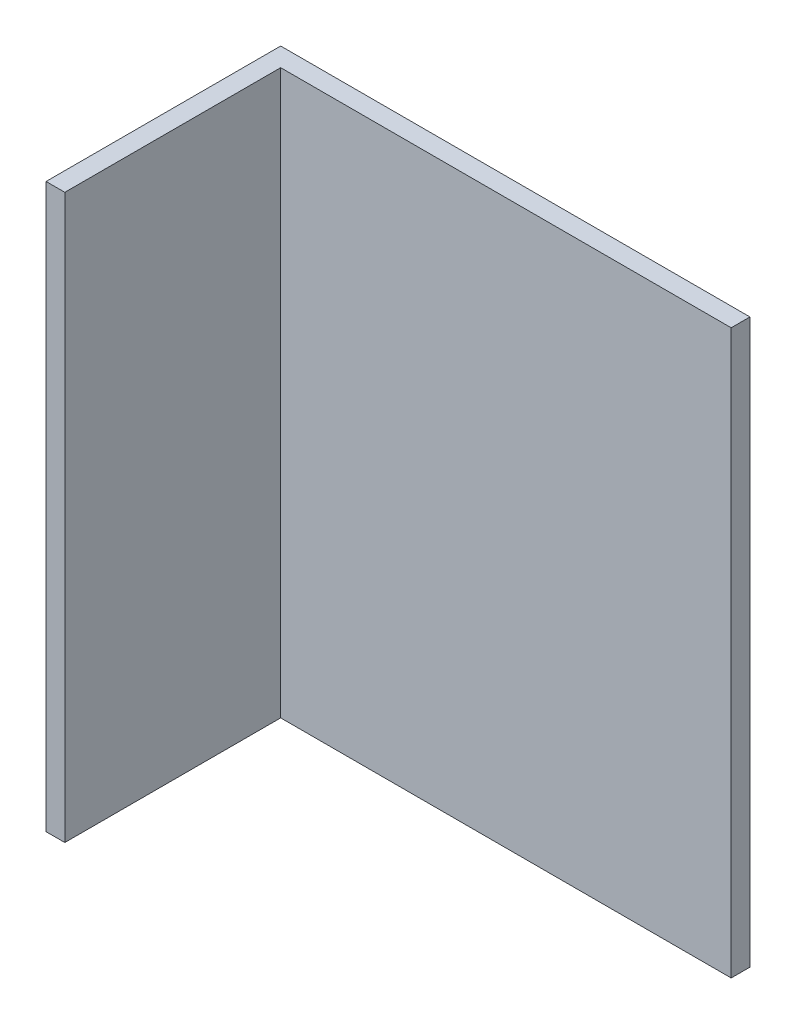
ISO-10303-21;
HEADER;
FILE_DESCRIPTION(('STEP AP214'),'2;1');
FILE_NAME('part.step','',(''),(''),'','','');
FILE_SCHEMA(('AUTOMOTIVE_DESIGN { 1 0 10303 214 1 1 1 1 }'));
ENDSEC;
DATA;
#1=APPLICATION_CONTEXT('core data for automotive mechanical design processes');
#2=APPLICATION_PROTOCOL_DEFINITION('international standard','automotive_design',2000,#1);
#3=PRODUCT_CONTEXT('',#1,'mechanical');
#4=PRODUCT('Part','Part','',(#3));
#5=PRODUCT_RELATED_PRODUCT_CATEGORY('part','',(#4));
#6=PRODUCT_DEFINITION_FORMATION('','',#4);
#7=PRODUCT_DEFINITION_CONTEXT('part definition',#1,'design');
#8=PRODUCT_DEFINITION('design','',#6,#7);
#9=PRODUCT_DEFINITION_SHAPE('','',#8);
#10=(LENGTH_UNIT() NAMED_UNIT(*) SI_UNIT(.MILLI.,.METRE.));
#11=(NAMED_UNIT(*) PLANE_ANGLE_UNIT() SI_UNIT($,.RADIAN.));
#12=(NAMED_UNIT(*) SI_UNIT($,.STERADIAN.) SOLID_ANGLE_UNIT());
#13=UNCERTAINTY_MEASURE_WITH_UNIT(LENGTH_MEASURE(1.E-05),#10,'distance_accuracy_value','');
#14=(GEOMETRIC_REPRESENTATION_CONTEXT(3) GLOBAL_UNCERTAINTY_ASSIGNED_CONTEXT((#13)) GLOBAL_UNIT_ASSIGNED_CONTEXT((#10,
#11,#12)) REPRESENTATION_CONTEXT('',''));
#15=CARTESIAN_POINT('',(0.,0.,0.));
#16=DIRECTION('',(0.,0.,1.));
#17=DIRECTION('',(1.,0.,0.));
#18=AXIS2_PLACEMENT_3D('',#15,#16,#17);
#19=CARTESIAN_POINT('',(0.,240.,8.));
#20=DIRECTION('',(0.,0.,-1.));
#21=DIRECTION('',(-1.,0.,0.));
#22=AXIS2_PLACEMENT_3D('',#19,#20,#21);
#23=PLANE('',#22);
#24=DIRECTION('',(0.,1.,0.));
#25=VECTOR('',#24,1.);
#26=CARTESIAN_POINT('',(8.,240.,8.));
#27=LINE('',#26,#25);
#28=CARTESIAN_POINT('',(8.00000000000001,0.,8.));
#29=VERTEX_POINT('',#28);
#30=CARTESIAN_POINT('',(8.,240.,8.));
#31=VERTEX_POINT('',#30);
#32=EDGE_CURVE('E49',#29,#31,#27,.T.);
#33=ORIENTED_EDGE('',*,*,#32,.F.);
#34=DIRECTION('',(1.,0.,0.));
#35=VECTOR('',#34,1.);
#36=CARTESIAN_POINT('',(0.,0.,8.));
#37=LINE('',#36,#35);
#38=CARTESIAN_POINT('',(200.,0.,8.));
#39=VERTEX_POINT('',#38);
#40=EDGE_CURVE('E86',#29,#39,#37,.T.);
#41=ORIENTED_EDGE('',*,*,#40,.T.);
#42=DIRECTION('',(0.,1.,0.));
#43=VECTOR('',#42,1.);
#44=CARTESIAN_POINT('',(200.,0.,8.));
#45=LINE('',#44,#43);
#46=CARTESIAN_POINT('',(200.,240.,8.));
#47=VERTEX_POINT('',#46);
#48=EDGE_CURVE('E55',#39,#47,#45,.T.);
#49=ORIENTED_EDGE('',*,*,#48,.T.);
#50=DIRECTION('',(-1.,0.,0.));
#51=VECTOR('',#50,1.);
#52=CARTESIAN_POINT('',(0.,240.,8.));
#53=LINE('',#52,#51);
#54=EDGE_CURVE('E96',#47,#31,#53,.T.);
#55=ORIENTED_EDGE('',*,*,#54,.T.);
#56=EDGE_LOOP('',(#33,#41,#49,#55));
#57=FACE_BOUND('',#56,.T.);
#58=ADVANCED_FACE('F32',(#57),#23,.F.);
#59=CARTESIAN_POINT('',(0.,0.,8.));
#60=DIRECTION('',(1.,0.,0.));
#61=DIRECTION('',(0.,0.,-1.));
#62=AXIS2_PLACEMENT_3D('',#59,#60,#61);
#63=PLANE('',#62);
#64=DIRECTION('',(0.,-1.,0.));
#65=VECTOR('',#64,1.);
#66=CARTESIAN_POINT('',(0.,0.,0.));
#67=LINE('',#66,#65);
#68=CARTESIAN_POINT('',(0.,240.,0.));
#69=VERTEX_POINT('',#68);
#70=CARTESIAN_POINT('',(0.,0.,0.));
#71=VERTEX_POINT('',#70);
#72=EDGE_CURVE('E93',#69,#71,#67,.T.);
#73=ORIENTED_EDGE('',*,*,#72,.T.);
#74=DIRECTION('',(0.,0.,-1.));
#75=VECTOR('',#74,1.);
#76=CARTESIAN_POINT('',(0.,0.,8.));
#77=LINE('',#76,#75);
#78=CARTESIAN_POINT('',(0.,0.,100.));
#79=VERTEX_POINT('',#78);
#80=EDGE_CURVE('E11',#79,#71,#77,.T.);
#81=ORIENTED_EDGE('',*,*,#80,.F.);
#82=DIRECTION('',(0.,-1.,0.));
#83=VECTOR('',#82,1.);
#84=CARTESIAN_POINT('',(0.,240.,100.));
#85=LINE('',#84,#83);
#86=CARTESIAN_POINT('',(0.,240.,100.));
#87=VERTEX_POINT('',#86);
#88=EDGE_CURVE('E95',#87,#79,#85,.T.);
#89=ORIENTED_EDGE('',*,*,#88,.F.);
#90=DIRECTION('',(0.,0.,-1.));
#91=VECTOR('',#90,1.);
#92=CARTESIAN_POINT('',(0.,240.,8.));
#93=LINE('',#92,#91);
#94=EDGE_CURVE('E79',#87,#69,#93,.T.);
#95=ORIENTED_EDGE('',*,*,#94,.T.);
#96=EDGE_LOOP('',(#73,#81,#89,#95));
#97=FACE_BOUND('',#96,.T.);
#98=ADVANCED_FACE('F34',(#97),#63,.F.);
#99=CARTESIAN_POINT('',(0.,0.,8.));
#100=DIRECTION('',(0.,1.,0.));
#101=DIRECTION('',(0.,0.,1.));
#102=AXIS2_PLACEMENT_3D('',#99,#100,#101);
#103=PLANE('',#102);
#104=DIRECTION('',(1.,0.,0.));
#105=VECTOR('',#104,1.);
#106=CARTESIAN_POINT('',(0.,0.,0.));
#107=LINE('',#106,#105);
#108=CARTESIAN_POINT('',(200.,0.,0.));
#109=VERTEX_POINT('',#108);
#110=EDGE_CURVE('E99',#71,#109,#107,.T.);
#111=ORIENTED_EDGE('',*,*,#110,.T.);
#112=DIRECTION('',(0.,0.,-1.));
#113=VECTOR('',#112,1.);
#114=CARTESIAN_POINT('',(200.,0.,8.));
#115=LINE('',#114,#113);
#116=EDGE_CURVE('E41',#39,#109,#115,.T.);
#117=ORIENTED_EDGE('',*,*,#116,.F.);
#118=ORIENTED_EDGE('',*,*,#40,.F.);
#119=DIRECTION('',(0.,0.,-1.));
#120=VECTOR('',#119,1.);
#121=CARTESIAN_POINT('',(8.00000000000003,0.,100.));
#122=LINE('',#121,#120);
#123=CARTESIAN_POINT('',(8.00000000000003,0.,100.));
#124=VERTEX_POINT('',#123);
#125=EDGE_CURVE('E100',#124,#29,#122,.T.);
#126=ORIENTED_EDGE('',*,*,#125,.F.);
#127=DIRECTION('',(1.,0.,0.));
#128=VECTOR('',#127,1.);
#129=CARTESIAN_POINT('',(0.,0.,100.));
#130=LINE('',#129,#128);
#131=EDGE_CURVE('E136',#79,#124,#130,.T.);
#132=ORIENTED_EDGE('',*,*,#131,.F.);
#133=ORIENTED_EDGE('',*,*,#80,.T.);
#134=EDGE_LOOP('',(#111,#117,#118,#126,#132,#133));
#135=FACE_BOUND('',#134,.T.);
#136=ADVANCED_FACE('F149',(#135),#103,.F.);
#137=CARTESIAN_POINT('',(200.,0.,8.));
#138=DIRECTION('',(-1.,0.,0.));
#139=DIRECTION('',(0.,0.,1.));
#140=AXIS2_PLACEMENT_3D('',#137,#138,#139);
#141=PLANE('',#140);
#142=DIRECTION('',(0.,1.,0.));
#143=VECTOR('',#142,1.);
#144=CARTESIAN_POINT('',(200.,0.,0.));
#145=LINE('',#144,#143);
#146=CARTESIAN_POINT('',(200.,240.,0.));
#147=VERTEX_POINT('',#146);
#148=EDGE_CURVE('E87',#109,#147,#145,.T.);
#149=ORIENTED_EDGE('',*,*,#148,.T.);
#150=DIRECTION('',(0.,0.,-1.));
#151=VECTOR('',#150,1.);
#152=CARTESIAN_POINT('',(200.,240.,8.));
#153=LINE('',#152,#151);
#154=EDGE_CURVE('E82',#47,#147,#153,.T.);
#155=ORIENTED_EDGE('',*,*,#154,.F.);
#156=ORIENTED_EDGE('',*,*,#48,.F.);
#157=ORIENTED_EDGE('',*,*,#116,.T.);
#158=EDGE_LOOP('',(#149,#155,#156,#157));
#159=FACE_BOUND('',#158,.T.);
#160=ADVANCED_FACE('F152',(#159),#141,.F.);
#161=CARTESIAN_POINT('',(0.,240.,8.));
#162=DIRECTION('',(0.,-1.,0.));
#163=DIRECTION('',(0.,0.,-1.));
#164=AXIS2_PLACEMENT_3D('',#161,#162,#163);
#165=PLANE('',#164);
#166=DIRECTION('',(-1.,0.,0.));
#167=VECTOR('',#166,1.);
#168=CARTESIAN_POINT('',(0.,240.,0.));
#169=LINE('',#168,#167);
#170=EDGE_CURVE('E75',#147,#69,#169,.T.);
#171=ORIENTED_EDGE('',*,*,#170,.T.);
#172=ORIENTED_EDGE('',*,*,#94,.F.);
#173=DIRECTION('',(-1.,0.,0.));
#174=VECTOR('',#173,1.);
#175=CARTESIAN_POINT('',(0.,240.,100.));
#176=LINE('',#175,#174);
#177=CARTESIAN_POINT('',(8.,240.,100.));
#178=VERTEX_POINT('',#177);
#179=EDGE_CURVE('E129',#178,#87,#176,.T.);
#180=ORIENTED_EDGE('',*,*,#179,.F.);
#181=DIRECTION('',(0.,0.,-1.));
#182=VECTOR('',#181,1.);
#183=CARTESIAN_POINT('',(8.,240.,100.));
#184=LINE('',#183,#182);
#185=EDGE_CURVE('E104',#178,#31,#184,.T.);
#186=ORIENTED_EDGE('',*,*,#185,.T.);
#187=ORIENTED_EDGE('',*,*,#54,.F.);
#188=ORIENTED_EDGE('',*,*,#154,.T.);
#189=EDGE_LOOP('',(#171,#172,#180,#186,#187,#188));
#190=FACE_BOUND('',#189,.T.);
#191=ADVANCED_FACE('F77',(#190),#165,.F.);
#192=CARTESIAN_POINT('',(0.,240.,0.));
#193=DIRECTION('',(0.,0.,-1.));
#194=DIRECTION('',(-1.,0.,0.));
#195=AXIS2_PLACEMENT_3D('',#192,#193,#194);
#196=PLANE('',#195);
#197=ORIENTED_EDGE('',*,*,#72,.F.);
#198=ORIENTED_EDGE('',*,*,#170,.F.);
#199=ORIENTED_EDGE('',*,*,#148,.F.);
#200=ORIENTED_EDGE('',*,*,#110,.F.);
#201=EDGE_LOOP('',(#197,#198,#199,#200));
#202=FACE_BOUND('',#201,.T.);
#203=ADVANCED_FACE('F98',(#202),#196,.T.);
#204=CARTESIAN_POINT('',(8.,240.,100.));
#205=DIRECTION('',(-1.,0.,0.));
#206=DIRECTION('',(0.,-1.,0.));
#207=AXIS2_PLACEMENT_3D('',#204,#205,#206);
#208=PLANE('',#207);
#209=ORIENTED_EDGE('',*,*,#32,.T.);
#210=ORIENTED_EDGE('',*,*,#185,.F.);
#211=DIRECTION('',(0.,1.,0.));
#212=VECTOR('',#211,1.);
#213=CARTESIAN_POINT('',(8.,240.,100.));
#214=LINE('',#213,#212);
#215=EDGE_CURVE('E131',#124,#178,#214,.T.);
#216=ORIENTED_EDGE('',*,*,#215,.F.);
#217=ORIENTED_EDGE('',*,*,#125,.T.);
#218=EDGE_LOOP('',(#209,#210,#216,#217));
#219=FACE_BOUND('',#218,.T.);
#220=ADVANCED_FACE('F125',(#219),#208,.F.);
#221=CARTESIAN_POINT('',(0.,0.,100.));
#222=DIRECTION('',(0.,0.,1.));
#223=DIRECTION('',(1.,0.,0.));
#224=AXIS2_PLACEMENT_3D('',#221,#222,#223);
#225=PLANE('',#224);
#226=ORIENTED_EDGE('',*,*,#88,.T.);
#227=ORIENTED_EDGE('',*,*,#131,.T.);
#228=ORIENTED_EDGE('',*,*,#215,.T.);
#229=ORIENTED_EDGE('',*,*,#179,.T.);
#230=EDGE_LOOP('',(#226,#227,#228,#229));
#231=FACE_BOUND('',#230,.T.);
#232=ADVANCED_FACE('F141',(#231),#225,.T.);
#233=CLOSED_SHELL('',(#58,#98,#136,#160,#191,#203,#220,#232));
#234=MANIFOLD_SOLID_BREP('B2',#233);
#235=ADVANCED_BREP_SHAPE_REPRESENTATION('',(#18,#234),#14);
#236=SHAPE_DEFINITION_REPRESENTATION(#9,#235);
ENDSEC;
END-ISO-10303-21;
